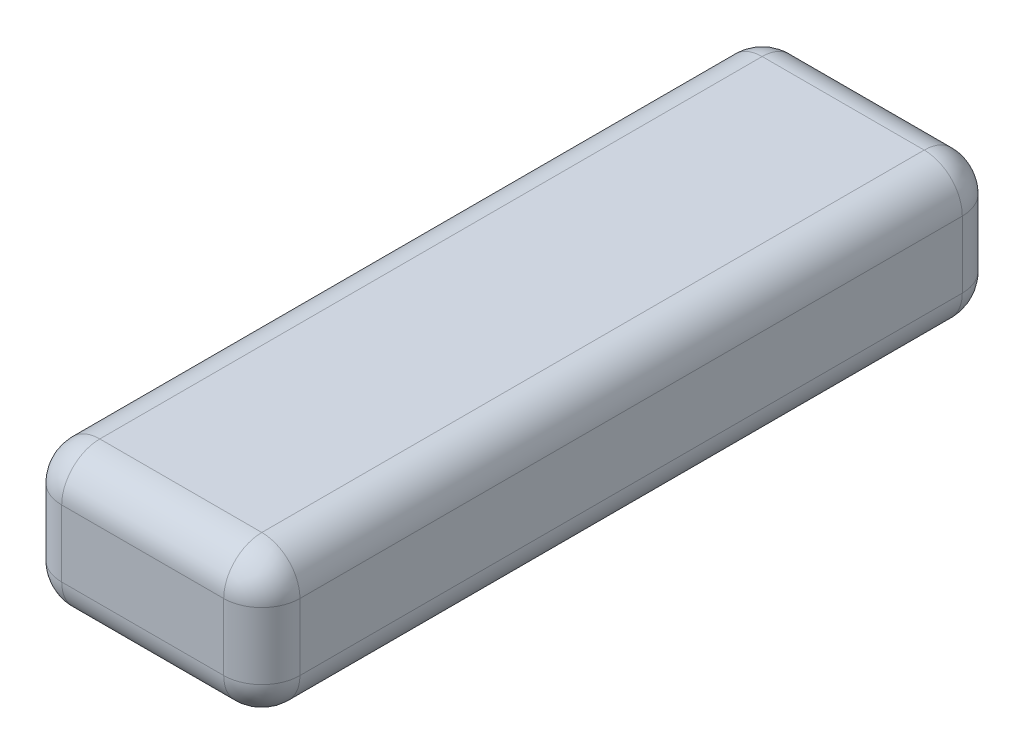
ISO-10303-21;
HEADER;
FILE_DESCRIPTION(('STEP AP214'),'2;1');
FILE_NAME('part.step','',(''),(''),'','','');
FILE_SCHEMA(('AUTOMOTIVE_DESIGN { 1 0 10303 214 1 1 1 1 }'));
ENDSEC;
DATA;
#1=APPLICATION_CONTEXT('core data for automotive mechanical design processes');
#2=APPLICATION_PROTOCOL_DEFINITION('international standard','automotive_design',2000,#1);
#3=PRODUCT_CONTEXT('',#1,'mechanical');
#4=PRODUCT('Part','Part','',(#3));
#5=PRODUCT_RELATED_PRODUCT_CATEGORY('part','',(#4));
#6=PRODUCT_DEFINITION_FORMATION('','',#4);
#7=PRODUCT_DEFINITION_CONTEXT('part definition',#1,'design');
#8=PRODUCT_DEFINITION('design','',#6,#7);
#9=PRODUCT_DEFINITION_SHAPE('','',#8);
#10=(LENGTH_UNIT() NAMED_UNIT(*) SI_UNIT(.MILLI.,.METRE.));
#11=(NAMED_UNIT(*) PLANE_ANGLE_UNIT() SI_UNIT($,.RADIAN.));
#12=(NAMED_UNIT(*) SI_UNIT($,.STERADIAN.) SOLID_ANGLE_UNIT());
#13=UNCERTAINTY_MEASURE_WITH_UNIT(LENGTH_MEASURE(1.E-05),#10,'distance_accuracy_value','');
#14=(GEOMETRIC_REPRESENTATION_CONTEXT(3) GLOBAL_UNCERTAINTY_ASSIGNED_CONTEXT((#13)) GLOBAL_UNIT_ASSIGNED_CONTEXT((#10,
#11,#12)) REPRESENTATION_CONTEXT('',''));
#15=CARTESIAN_POINT('',(0.,0.,0.));
#16=DIRECTION('',(0.,0.,1.));
#17=DIRECTION('',(1.,0.,0.));
#18=AXIS2_PLACEMENT_3D('',#15,#16,#17);
#19=CARTESIAN_POINT('',(-25.,15.,155.));
#20=DIRECTION('',(1.,0.,0.));
#21=DIRECTION('',(0.,1.,0.));
#22=AXIS2_PLACEMENT_3D('',#19,#20,#21);
#23=PLANE('',#22);
#24=DIRECTION('',(0.,-1.,0.));
#25=VECTOR('',#24,1.);
#26=CARTESIAN_POINT('',(-25.,15.,8.00000000000001));
#27=LINE('',#26,#25);
#28=CARTESIAN_POINT('',(-25.,6.99999999999999,8.00000000000001));
#29=VERTEX_POINT('',#28);
#30=CARTESIAN_POINT('',(-25.,-7.00000000000001,8.00000000000001));
#31=VERTEX_POINT('',#30);
#32=EDGE_CURVE('E163',#29,#31,#27,.T.);
#33=ORIENTED_EDGE('',*,*,#32,.T.);
#34=DIRECTION('',(0.,0.,-1.));
#35=VECTOR('',#34,1.);
#36=CARTESIAN_POINT('',(-25.,-7.00000000000001,155.));
#37=LINE('',#36,#35);
#38=CARTESIAN_POINT('',(-25.,-7.00000000000001,147.));
#39=VERTEX_POINT('',#38);
#40=EDGE_CURVE('E133',#31,#39,#37,.F.);
#41=ORIENTED_EDGE('',*,*,#40,.T.);
#42=DIRECTION('',(0.,-1.,0.));
#43=VECTOR('',#42,1.);
#44=CARTESIAN_POINT('',(-25.,15.,147.));
#45=LINE('',#44,#43);
#46=CARTESIAN_POINT('',(-25.,6.99999999999999,147.));
#47=VERTEX_POINT('',#46);
#48=EDGE_CURVE('E169',#39,#47,#45,.F.);
#49=ORIENTED_EDGE('',*,*,#48,.T.);
#50=DIRECTION('',(0.,0.,-1.));
#51=VECTOR('',#50,1.);
#52=CARTESIAN_POINT('',(-25.,6.99999999999999,155.));
#53=LINE('',#52,#51);
#54=EDGE_CURVE('E161',#47,#29,#53,.T.);
#55=ORIENTED_EDGE('',*,*,#54,.T.);
#56=EDGE_LOOP('',(#33,#41,#49,#55));
#57=FACE_BOUND('',#56,.T.);
#58=ADVANCED_FACE('F33',(#57),#23,.F.);
#59=CARTESIAN_POINT('',(-25.,-15.,155.));
#60=DIRECTION('',(0.,1.,0.));
#61=DIRECTION('',(-1.,0.,0.));
#62=AXIS2_PLACEMENT_3D('',#59,#60,#61);
#63=PLANE('',#62);
#64=DIRECTION('',(1.,0.,0.));
#65=VECTOR('',#64,1.);
#66=CARTESIAN_POINT('',(-25.,-15.,147.));
#67=LINE('',#66,#65);
#68=CARTESIAN_POINT('',(17.,-15.,147.));
#69=VERTEX_POINT('',#68);
#70=CARTESIAN_POINT('',(-17.,-15.,147.));
#71=VERTEX_POINT('',#70);
#72=EDGE_CURVE('E159',#69,#71,#67,.F.);
#73=ORIENTED_EDGE('',*,*,#72,.T.);
#74=DIRECTION('',(0.,0.,-1.));
#75=VECTOR('',#74,1.);
#76=CARTESIAN_POINT('',(-17.,-15.,155.));
#77=LINE('',#76,#75);
#78=CARTESIAN_POINT('',(-17.,-15.,8.00000000000001));
#79=VERTEX_POINT('',#78);
#80=EDGE_CURVE('E131',#71,#79,#77,.T.);
#81=ORIENTED_EDGE('',*,*,#80,.T.);
#82=DIRECTION('',(1.,0.,0.));
#83=VECTOR('',#82,1.);
#84=CARTESIAN_POINT('',(-25.,-15.,8.00000000000001));
#85=LINE('',#84,#83);
#86=CARTESIAN_POINT('',(17.,-15.,8.00000000000001));
#87=VERTEX_POINT('',#86);
#88=EDGE_CURVE('E149',#79,#87,#85,.T.);
#89=ORIENTED_EDGE('',*,*,#88,.T.);
#90=DIRECTION('',(0.,0.,-1.));
#91=VECTOR('',#90,1.);
#92=CARTESIAN_POINT('',(17.,-15.,155.));
#93=LINE('',#92,#91);
#94=EDGE_CURVE('E155',#87,#69,#93,.F.);
#95=ORIENTED_EDGE('',*,*,#94,.T.);
#96=EDGE_LOOP('',(#73,#81,#89,#95));
#97=FACE_BOUND('',#96,.T.);
#98=ADVANCED_FACE('F157',(#97),#63,.F.);
#99=CARTESIAN_POINT('',(25.,15.,155.));
#100=DIRECTION('',(-1.,0.,0.));
#101=DIRECTION('',(0.,-1.,0.));
#102=AXIS2_PLACEMENT_3D('',#99,#100,#101);
#103=PLANE('',#102);
#104=DIRECTION('',(0.,1.,0.));
#105=VECTOR('',#104,1.);
#106=CARTESIAN_POINT('',(25.,-15.,147.));
#107=LINE('',#106,#105);
#108=CARTESIAN_POINT('',(25.,6.99999999999999,147.));
#109=VERTEX_POINT('',#108);
#110=CARTESIAN_POINT('',(25.,-7.00000000000001,147.));
#111=VERTEX_POINT('',#110);
#112=EDGE_CURVE('E183',#109,#111,#107,.F.);
#113=ORIENTED_EDGE('',*,*,#112,.T.);
#114=DIRECTION('',(0.,0.,-1.));
#115=VECTOR('',#114,1.);
#116=CARTESIAN_POINT('',(25.,-7.,155.));
#117=LINE('',#116,#115);
#118=CARTESIAN_POINT('',(25.,-7.00000000000001,8.00000000000001));
#119=VERTEX_POINT('',#118);
#120=EDGE_CURVE('E187',#111,#119,#117,.T.);
#121=ORIENTED_EDGE('',*,*,#120,.T.);
#122=DIRECTION('',(0.,1.,0.));
#123=VECTOR('',#122,1.);
#124=CARTESIAN_POINT('',(25.,15.,8.00000000000001));
#125=LINE('',#124,#123);
#126=CARTESIAN_POINT('',(25.,6.99999999999999,8.00000000000001));
#127=VERTEX_POINT('',#126);
#128=EDGE_CURVE('E185',#119,#127,#125,.T.);
#129=ORIENTED_EDGE('',*,*,#128,.T.);
#130=DIRECTION('',(0.,0.,-1.));
#131=VECTOR('',#130,1.);
#132=CARTESIAN_POINT('',(25.,6.99999999999999,155.));
#133=LINE('',#132,#131);
#134=EDGE_CURVE('E181',#127,#109,#133,.F.);
#135=ORIENTED_EDGE('',*,*,#134,.T.);
#136=EDGE_LOOP('',(#113,#121,#129,#135));
#137=FACE_BOUND('',#136,.T.);
#138=ADVANCED_FACE('F281',(#137),#103,.F.);
#139=CARTESIAN_POINT('',(-25.,15.,155.));
#140=DIRECTION('',(0.,-1.,0.));
#141=DIRECTION('',(0.,0.,-1.));
#142=AXIS2_PLACEMENT_3D('',#139,#140,#141);
#143=PLANE('',#142);
#144=DIRECTION('',(0.,0.,-1.));
#145=VECTOR('',#144,1.);
#146=CARTESIAN_POINT('',(17.,15.,155.));
#147=LINE('',#146,#145);
#148=CARTESIAN_POINT('',(17.,15.,147.));
#149=VERTEX_POINT('',#148);
#150=CARTESIAN_POINT('',(17.,15.,8.00000000000001));
#151=VERTEX_POINT('',#150);
#152=EDGE_CURVE('E57',#149,#151,#147,.T.);
#153=ORIENTED_EDGE('',*,*,#152,.T.);
#154=DIRECTION('',(-1.,0.,0.));
#155=VECTOR('',#154,1.);
#156=CARTESIAN_POINT('',(-25.,15.,8.00000000000001));
#157=LINE('',#156,#155);
#158=CARTESIAN_POINT('',(-17.,15.,8.00000000000001));
#159=VERTEX_POINT('',#158);
#160=EDGE_CURVE('E11',#151,#159,#157,.T.);
#161=ORIENTED_EDGE('',*,*,#160,.T.);
#162=DIRECTION('',(0.,0.,-1.));
#163=VECTOR('',#162,1.);
#164=CARTESIAN_POINT('',(-17.,15.,155.));
#165=LINE('',#164,#163);
#166=CARTESIAN_POINT('',(-17.,15.,147.));
#167=VERTEX_POINT('',#166);
#168=EDGE_CURVE('E42',#159,#167,#165,.F.);
#169=ORIENTED_EDGE('',*,*,#168,.T.);
#170=DIRECTION('',(-1.,0.,0.));
#171=VECTOR('',#170,1.);
#172=CARTESIAN_POINT('',(25.,15.,147.));
#173=LINE('',#172,#171);
#174=EDGE_CURVE('E199',#167,#149,#173,.F.);
#175=ORIENTED_EDGE('',*,*,#174,.T.);
#176=EDGE_LOOP('',(#153,#161,#169,#175));
#177=FACE_BOUND('',#176,.T.);
#178=ADVANCED_FACE('F299',(#177),#143,.F.);
#179=CARTESIAN_POINT('',(0.,0.,155.));
#180=DIRECTION('',(0.,0.,1.));
#181=DIRECTION('',(1.,0.,0.));
#182=AXIS2_PLACEMENT_3D('',#179,#180,#181);
#183=PLANE('',#182);
#184=DIRECTION('',(0.,-1.,0.));
#185=VECTOR('',#184,1.);
#186=CARTESIAN_POINT('',(-17.,-15.,155.));
#187=LINE('',#186,#185);
#188=CARTESIAN_POINT('',(-17.,6.99999999999999,155.));
#189=VERTEX_POINT('',#188);
#190=CARTESIAN_POINT('',(-17.,-7.00000000000001,155.));
#191=VERTEX_POINT('',#190);
#192=EDGE_CURVE('E176',#189,#191,#187,.T.);
#193=ORIENTED_EDGE('',*,*,#192,.T.);
#194=DIRECTION('',(1.,0.,0.));
#195=VECTOR('',#194,1.);
#196=CARTESIAN_POINT('',(25.,-7.,155.));
#197=LINE('',#196,#195);
#198=CARTESIAN_POINT('',(17.,-7.,155.));
#199=VERTEX_POINT('',#198);
#200=EDGE_CURVE('E178',#191,#199,#197,.T.);
#201=ORIENTED_EDGE('',*,*,#200,.T.);
#202=DIRECTION('',(0.,1.,0.));
#203=VECTOR('',#202,1.);
#204=CARTESIAN_POINT('',(17.,15.,155.));
#205=LINE('',#204,#203);
#206=CARTESIAN_POINT('',(17.,6.99999999999999,155.));
#207=VERTEX_POINT('',#206);
#208=EDGE_CURVE('E174',#199,#207,#205,.T.);
#209=ORIENTED_EDGE('',*,*,#208,.T.);
#210=DIRECTION('',(-1.,0.,0.));
#211=VECTOR('',#210,1.);
#212=CARTESIAN_POINT('',(-25.,6.99999999999999,155.));
#213=LINE('',#212,#211);
#214=EDGE_CURVE('E172',#207,#189,#213,.T.);
#215=ORIENTED_EDGE('',*,*,#214,.T.);
#216=EDGE_LOOP('',(#193,#201,#209,#215));
#217=FACE_BOUND('',#216,.T.);
#218=ADVANCED_FACE('F272',(#217),#183,.T.);
#219=CARTESIAN_POINT('',(0.,0.,0.));
#220=DIRECTION('',(0.,0.,1.));
#221=DIRECTION('',(1.,0.,0.));
#222=AXIS2_PLACEMENT_3D('',#219,#220,#221);
#223=PLANE('',#222);
#224=DIRECTION('',(0.,1.,0.));
#225=VECTOR('',#224,1.);
#226=CARTESIAN_POINT('',(17.,0.,0.));
#227=LINE('',#226,#225);
#228=CARTESIAN_POINT('',(17.,6.99999999999999,0.));
#229=VERTEX_POINT('',#228);
#230=CARTESIAN_POINT('',(17.,-7.,0.));
#231=VERTEX_POINT('',#230);
#232=EDGE_CURVE('E192',#229,#231,#227,.F.);
#233=ORIENTED_EDGE('',*,*,#232,.T.);
#234=DIRECTION('',(1.,0.,0.));
#235=VECTOR('',#234,1.);
#236=CARTESIAN_POINT('',(0.,-7.00000000000001,0.));
#237=LINE('',#236,#235);
#238=CARTESIAN_POINT('',(-17.,-7.00000000000001,0.));
#239=VERTEX_POINT('',#238);
#240=EDGE_CURVE('E196',#231,#239,#237,.F.);
#241=ORIENTED_EDGE('',*,*,#240,.T.);
#242=DIRECTION('',(0.,-1.,0.));
#243=VECTOR('',#242,1.);
#244=CARTESIAN_POINT('',(-17.,0.,0.));
#245=LINE('',#244,#243);
#246=CARTESIAN_POINT('',(-17.,6.99999999999999,0.));
#247=VERTEX_POINT('',#246);
#248=EDGE_CURVE('E194',#239,#247,#245,.F.);
#249=ORIENTED_EDGE('',*,*,#248,.T.);
#250=DIRECTION('',(-1.,0.,0.));
#251=VECTOR('',#250,1.);
#252=CARTESIAN_POINT('',(0.,6.99999999999999,0.));
#253=LINE('',#252,#251);
#254=EDGE_CURVE('E190',#247,#229,#253,.F.);
#255=ORIENTED_EDGE('',*,*,#254,.T.);
#256=EDGE_LOOP('',(#233,#241,#249,#255));
#257=FACE_BOUND('',#256,.T.);
#258=ADVANCED_FACE('F476',(#257),#223,.F.);
#259=CARTESIAN_POINT('',(17.,6.99999999999999,155.));
#260=DIRECTION('',(0.,0.,-1.));
#261=DIRECTION('',(-1.,0.,0.));
#262=AXIS2_PLACEMENT_3D('',#259,#260,#261);
#263=CYLINDRICAL_SURFACE('',#262,8.);
#264=CARTESIAN_POINT('',(17.,6.99999999999999,147.));
#265=DIRECTION('',(0.,0.,1.));
#266=DIRECTION('',(1.,0.,0.));
#267=AXIS2_PLACEMENT_3D('',#264,#265,#266);
#268=CIRCLE('',#267,8.);
#269=EDGE_CURVE('E37',#109,#149,#268,.T.);
#270=ORIENTED_EDGE('',*,*,#269,.F.);
#271=ORIENTED_EDGE('',*,*,#134,.F.);
#272=CARTESIAN_POINT('',(17.,6.99999999999999,8.00000000000001));
#273=DIRECTION('',(0.,0.,-1.));
#274=DIRECTION('',(-1.,0.,0.));
#275=AXIS2_PLACEMENT_3D('',#272,#273,#274);
#276=CIRCLE('',#275,8.);
#277=EDGE_CURVE('E250',#151,#127,#276,.T.);
#278=ORIENTED_EDGE('',*,*,#277,.F.);
#279=ORIENTED_EDGE('',*,*,#152,.F.);
#280=EDGE_LOOP('',(#270,#271,#278,#279));
#281=FACE_BOUND('',#280,.T.);
#282=ADVANCED_FACE('F35',(#281),#263,.T.);
#283=CARTESIAN_POINT('',(17.,6.99999999999999,147.));
#284=DIRECTION('',(0.,0.,1.));
#285=DIRECTION('',(1.,0.,0.));
#286=AXIS2_PLACEMENT_3D('',#283,#284,#285);
#287=SPHERICAL_SURFACE('',#286,8.);
#288=CARTESIAN_POINT('',(17.,6.99999999999999,147.));
#289=DIRECTION('',(0.,1.,0.));
#290=DIRECTION('',(-1.,0.,0.));
#291=AXIS2_PLACEMENT_3D('',#288,#289,#290);
#292=CIRCLE('',#291,8.);
#293=EDGE_CURVE('E245',#109,#207,#292,.F.);
#294=ORIENTED_EDGE('',*,*,#293,.F.);
#295=ORIENTED_EDGE('',*,*,#269,.T.);
#296=CARTESIAN_POINT('',(17.,6.99999999999999,147.));
#297=DIRECTION('',(1.,0.,0.));
#298=DIRECTION('',(0.,0.,-1.));
#299=AXIS2_PLACEMENT_3D('',#296,#297,#298);
#300=CIRCLE('',#299,8.);
#301=EDGE_CURVE('E248',#207,#149,#300,.F.);
#302=ORIENTED_EDGE('',*,*,#301,.F.);
#303=EDGE_LOOP('',(#294,#295,#302));
#304=FACE_BOUND('',#303,.T.);
#305=ADVANCED_FACE('F260',(#304),#287,.T.);
#306=CARTESIAN_POINT('',(17.,6.99999999999999,8.));
#307=DIRECTION('',(0.,0.,1.));
#308=DIRECTION('',(1.,0.,0.));
#309=AXIS2_PLACEMENT_3D('',#306,#307,#308);
#310=SPHERICAL_SURFACE('',#309,8.);
#311=CARTESIAN_POINT('',(17.,6.99999999999999,8.));
#312=DIRECTION('',(1.,0.,0.));
#313=DIRECTION('',(0.,0.,-1.));
#314=AXIS2_PLACEMENT_3D('',#311,#312,#313);
#315=CIRCLE('',#314,8.);
#316=EDGE_CURVE('E239',#151,#229,#315,.F.);
#317=ORIENTED_EDGE('',*,*,#316,.F.);
#318=ORIENTED_EDGE('',*,*,#277,.T.);
#319=CARTESIAN_POINT('',(17.,6.99999999999999,8.00000000000001));
#320=DIRECTION('',(0.,1.,0.));
#321=DIRECTION('',(-1.,0.,0.));
#322=AXIS2_PLACEMENT_3D('',#319,#320,#321);
#323=CIRCLE('',#322,8.);
#324=EDGE_CURVE('E242',#229,#127,#323,.F.);
#325=ORIENTED_EDGE('',*,*,#324,.F.);
#326=EDGE_LOOP('',(#317,#318,#325));
#327=FACE_BOUND('',#326,.T.);
#328=ADVANCED_FACE('F294',(#327),#310,.T.);
#329=CARTESIAN_POINT('',(0.,6.99999999999999,147.));
#330=DIRECTION('',(1.,0.,0.));
#331=DIRECTION('',(0.,0.,-1.));
#332=AXIS2_PLACEMENT_3D('',#329,#330,#331);
#333=CYLINDRICAL_SURFACE('',#332,8.);
#334=ORIENTED_EDGE('',*,*,#301,.T.);
#335=ORIENTED_EDGE('',*,*,#174,.F.);
#336=CARTESIAN_POINT('',(-17.,6.99999999999999,147.));
#337=DIRECTION('',(-1.,0.,0.));
#338=DIRECTION('',(0.,0.,1.));
#339=AXIS2_PLACEMENT_3D('',#336,#337,#338);
#340=CIRCLE('',#339,8.);
#341=EDGE_CURVE('E233',#189,#167,#340,.T.);
#342=ORIENTED_EDGE('',*,*,#341,.F.);
#343=ORIENTED_EDGE('',*,*,#214,.F.);
#344=EDGE_LOOP('',(#334,#335,#342,#343));
#345=FACE_BOUND('',#344,.T.);
#346=ADVANCED_FACE('F267',(#345),#333,.T.);
#347=CARTESIAN_POINT('',(17.,0.,147.));
#348=DIRECTION('',(0.,-1.,0.));
#349=DIRECTION('',(1.,0.,0.));
#350=AXIS2_PLACEMENT_3D('',#347,#348,#349);
#351=CYLINDRICAL_SURFACE('',#350,8.);
#352=ORIENTED_EDGE('',*,*,#293,.T.);
#353=ORIENTED_EDGE('',*,*,#208,.F.);
#354=CARTESIAN_POINT('',(17.,-7.00000000000001,147.));
#355=DIRECTION('',(0.,-1.,0.));
#356=DIRECTION('',(0.,0.,-1.));
#357=AXIS2_PLACEMENT_3D('',#354,#355,#356);
#358=CIRCLE('',#357,8.);
#359=EDGE_CURVE('E230',#111,#199,#358,.T.);
#360=ORIENTED_EDGE('',*,*,#359,.F.);
#361=ORIENTED_EDGE('',*,*,#112,.F.);
#362=EDGE_LOOP('',(#352,#353,#360,#361));
#363=FACE_BOUND('',#362,.T.);
#364=ADVANCED_FACE('F278',(#363),#351,.T.);
#365=CARTESIAN_POINT('',(17.,-7.00000000000001,155.));
#366=DIRECTION('',(0.,0.,-1.));
#367=DIRECTION('',(-1.,0.,0.));
#368=AXIS2_PLACEMENT_3D('',#365,#366,#367);
#369=CYLINDRICAL_SURFACE('',#368,8.);
#370=CARTESIAN_POINT('',(17.,-7.00000000000001,8.00000000000001));
#371=DIRECTION('',(0.,0.,-1.));
#372=DIRECTION('',(-1.,0.,0.));
#373=AXIS2_PLACEMENT_3D('',#370,#371,#372);
#374=CIRCLE('',#373,8.);
#375=EDGE_CURVE('E224',#119,#87,#374,.T.);
#376=ORIENTED_EDGE('',*,*,#375,.F.);
#377=ORIENTED_EDGE('',*,*,#120,.F.);
#378=CARTESIAN_POINT('',(17.,-7.,147.));
#379=DIRECTION('',(0.,0.,1.));
#380=DIRECTION('',(1.,0.,0.));
#381=AXIS2_PLACEMENT_3D('',#378,#379,#380);
#382=CIRCLE('',#381,8.);
#383=EDGE_CURVE('E227',#69,#111,#382,.T.);
#384=ORIENTED_EDGE('',*,*,#383,.F.);
#385=ORIENTED_EDGE('',*,*,#94,.F.);
#386=EDGE_LOOP('',(#376,#377,#384,#385));
#387=FACE_BOUND('',#386,.T.);
#388=ADVANCED_FACE('F285',(#387),#369,.T.);
#389=CARTESIAN_POINT('',(17.,15.,8.00000000000001));
#390=DIRECTION('',(0.,1.,0.));
#391=DIRECTION('',(-1.,0.,0.));
#392=AXIS2_PLACEMENT_3D('',#389,#390,#391);
#393=CYLINDRICAL_SURFACE('',#392,8.);
#394=ORIENTED_EDGE('',*,*,#324,.T.);
#395=ORIENTED_EDGE('',*,*,#128,.F.);
#396=CARTESIAN_POINT('',(17.,-7.,8.));
#397=DIRECTION('',(0.,-1.,0.));
#398=DIRECTION('',(1.,0.,0.));
#399=AXIS2_PLACEMENT_3D('',#396,#397,#398);
#400=CIRCLE('',#399,8.);
#401=EDGE_CURVE('E222',#231,#119,#400,.T.);
#402=ORIENTED_EDGE('',*,*,#401,.F.);
#403=ORIENTED_EDGE('',*,*,#232,.F.);
#404=EDGE_LOOP('',(#394,#395,#402,#403));
#405=FACE_BOUND('',#404,.T.);
#406=ADVANCED_FACE('F291',(#405),#393,.T.);
#407=CARTESIAN_POINT('',(-25.,6.99999999999999,8.00000000000001));
#408=DIRECTION('',(-1.,0.,0.));
#409=DIRECTION('',(0.,0.,1.));
#410=AXIS2_PLACEMENT_3D('',#407,#408,#409);
#411=CYLINDRICAL_SURFACE('',#410,8.);
#412=ORIENTED_EDGE('',*,*,#316,.T.);
#413=ORIENTED_EDGE('',*,*,#254,.F.);
#414=CARTESIAN_POINT('',(-17.,6.99999999999999,8.00000000000001));
#415=DIRECTION('',(-1.,0.,0.));
#416=DIRECTION('',(0.,0.,1.));
#417=AXIS2_PLACEMENT_3D('',#414,#415,#416);
#418=CIRCLE('',#417,8.);
#419=EDGE_CURVE('E220',#159,#247,#418,.T.);
#420=ORIENTED_EDGE('',*,*,#419,.F.);
#421=ORIENTED_EDGE('',*,*,#160,.F.);
#422=EDGE_LOOP('',(#412,#413,#420,#421));
#423=FACE_BOUND('',#422,.T.);
#424=ADVANCED_FACE('F297',(#423),#411,.T.);
#425=CARTESIAN_POINT('',(-17.,6.99999999999999,155.));
#426=DIRECTION('',(0.,0.,-1.));
#427=DIRECTION('',(-1.,0.,0.));
#428=AXIS2_PLACEMENT_3D('',#425,#426,#427);
#429=CYLINDRICAL_SURFACE('',#428,8.);
#430=CARTESIAN_POINT('',(-17.,6.99999999999999,147.));
#431=DIRECTION('',(0.,0.,1.));
#432=DIRECTION('',(1.,0.,0.));
#433=AXIS2_PLACEMENT_3D('',#430,#431,#432);
#434=CIRCLE('',#433,8.);
#435=EDGE_CURVE('E236',#167,#47,#434,.T.);
#436=ORIENTED_EDGE('',*,*,#435,.F.);
#437=ORIENTED_EDGE('',*,*,#168,.F.);
#438=CARTESIAN_POINT('',(-17.,6.99999999999999,8.00000000000001));
#439=DIRECTION('',(0.,0.,-1.));
#440=DIRECTION('',(-1.,0.,0.));
#441=AXIS2_PLACEMENT_3D('',#438,#439,#440);
#442=CIRCLE('',#441,8.);
#443=EDGE_CURVE('E50',#29,#159,#442,.T.);
#444=ORIENTED_EDGE('',*,*,#443,.F.);
#445=ORIENTED_EDGE('',*,*,#54,.F.);
#446=EDGE_LOOP('',(#436,#437,#444,#445));
#447=FACE_BOUND('',#446,.T.);
#448=ADVANCED_FACE('F301',(#447),#429,.T.);
#449=CARTESIAN_POINT('',(-17.,6.99999999999999,147.));
#450=DIRECTION('',(0.,0.,1.));
#451=DIRECTION('',(1.,0.,0.));
#452=AXIS2_PLACEMENT_3D('',#449,#450,#451);
#453=SPHERICAL_SURFACE('',#452,8.);
#454=ORIENTED_EDGE('',*,*,#341,.T.);
#455=ORIENTED_EDGE('',*,*,#435,.T.);
#456=CARTESIAN_POINT('',(-17.,6.99999999999999,147.));
#457=DIRECTION('',(0.,1.,0.));
#458=DIRECTION('',(-1.,0.,0.));
#459=AXIS2_PLACEMENT_3D('',#456,#457,#458);
#460=CIRCLE('',#459,8.);
#461=EDGE_CURVE('E216',#189,#47,#460,.F.);
#462=ORIENTED_EDGE('',*,*,#461,.F.);
#463=EDGE_LOOP('',(#454,#455,#462));
#464=FACE_BOUND('',#463,.T.);
#465=ADVANCED_FACE('F304',(#464),#453,.T.);
#466=CARTESIAN_POINT('',(17.,-7.,147.));
#467=DIRECTION('',(0.,0.,1.));
#468=DIRECTION('',(1.,0.,0.));
#469=AXIS2_PLACEMENT_3D('',#466,#467,#468);
#470=SPHERICAL_SURFACE('',#469,8.);
#471=ORIENTED_EDGE('',*,*,#383,.T.);
#472=ORIENTED_EDGE('',*,*,#359,.T.);
#473=CARTESIAN_POINT('',(17.,-7.,147.));
#474=DIRECTION('',(1.,0.,0.));
#475=DIRECTION('',(0.,0.,-1.));
#476=AXIS2_PLACEMENT_3D('',#473,#474,#475);
#477=CIRCLE('',#476,8.);
#478=EDGE_CURVE('E214',#69,#199,#477,.F.);
#479=ORIENTED_EDGE('',*,*,#478,.F.);
#480=EDGE_LOOP('',(#471,#472,#479));
#481=FACE_BOUND('',#480,.T.);
#482=ADVANCED_FACE('F315',(#481),#470,.T.);
#483=CARTESIAN_POINT('',(17.,-7.,8.));
#484=DIRECTION('',(0.,0.,1.));
#485=DIRECTION('',(1.,0.,0.));
#486=AXIS2_PLACEMENT_3D('',#483,#484,#485);
#487=SPHERICAL_SURFACE('',#486,8.);
#488=ORIENTED_EDGE('',*,*,#401,.T.);
#489=ORIENTED_EDGE('',*,*,#375,.T.);
#490=CARTESIAN_POINT('',(17.,-7.,8.00000000000001));
#491=DIRECTION('',(1.,0.,0.));
#492=DIRECTION('',(0.,0.,-1.));
#493=AXIS2_PLACEMENT_3D('',#490,#491,#492);
#494=CIRCLE('',#493,8.);
#495=EDGE_CURVE('E152',#231,#87,#494,.F.);
#496=ORIENTED_EDGE('',*,*,#495,.F.);
#497=EDGE_LOOP('',(#488,#489,#496));
#498=FACE_BOUND('',#497,.T.);
#499=ADVANCED_FACE('F317',(#498),#487,.T.);
#500=CARTESIAN_POINT('',(-17.,6.99999999999999,8.));
#501=DIRECTION('',(0.,0.,1.));
#502=DIRECTION('',(1.,0.,0.));
#503=AXIS2_PLACEMENT_3D('',#500,#501,#502);
#504=SPHERICAL_SURFACE('',#503,8.);
#505=ORIENTED_EDGE('',*,*,#443,.T.);
#506=ORIENTED_EDGE('',*,*,#419,.T.);
#507=CARTESIAN_POINT('',(-17.,6.99999999999999,8.));
#508=DIRECTION('',(0.,1.,0.));
#509=DIRECTION('',(-1.,0.,0.));
#510=AXIS2_PLACEMENT_3D('',#507,#508,#509);
#511=CIRCLE('',#510,8.);
#512=EDGE_CURVE('E210',#29,#247,#511,.F.);
#513=ORIENTED_EDGE('',*,*,#512,.F.);
#514=EDGE_LOOP('',(#505,#506,#513));
#515=FACE_BOUND('',#514,.T.);
#516=ADVANCED_FACE('F323',(#515),#504,.T.);
#517=CARTESIAN_POINT('',(-17.,0.,147.));
#518=DIRECTION('',(0.,1.,0.));
#519=DIRECTION('',(-1.,0.,0.));
#520=AXIS2_PLACEMENT_3D('',#517,#518,#519);
#521=CYLINDRICAL_SURFACE('',#520,8.);
#522=ORIENTED_EDGE('',*,*,#461,.T.);
#523=ORIENTED_EDGE('',*,*,#48,.F.);
#524=CARTESIAN_POINT('',(-17.,-7.00000000000001,147.));
#525=DIRECTION('',(0.,-1.,0.));
#526=DIRECTION('',(1.,0.,0.));
#527=AXIS2_PLACEMENT_3D('',#524,#525,#526);
#528=CIRCLE('',#527,8.);
#529=EDGE_CURVE('E207',#191,#39,#528,.T.);
#530=ORIENTED_EDGE('',*,*,#529,.F.);
#531=ORIENTED_EDGE('',*,*,#192,.F.);
#532=EDGE_LOOP('',(#522,#523,#530,#531));
#533=FACE_BOUND('',#532,.T.);
#534=ADVANCED_FACE('F308',(#533),#521,.T.);
#535=CARTESIAN_POINT('',(0.,-7.00000000000001,147.));
#536=DIRECTION('',(-1.,0.,0.));
#537=DIRECTION('',(0.,-1.,0.));
#538=AXIS2_PLACEMENT_3D('',#535,#536,#537);
#539=CYLINDRICAL_SURFACE('',#538,8.);
#540=ORIENTED_EDGE('',*,*,#478,.T.);
#541=ORIENTED_EDGE('',*,*,#200,.F.);
#542=CARTESIAN_POINT('',(-17.,-7.00000000000001,147.));
#543=DIRECTION('',(-1.,0.,0.));
#544=DIRECTION('',(0.,0.,1.));
#545=AXIS2_PLACEMENT_3D('',#542,#543,#544);
#546=CIRCLE('',#545,8.);
#547=EDGE_CURVE('E146',#71,#191,#546,.T.);
#548=ORIENTED_EDGE('',*,*,#547,.F.);
#549=ORIENTED_EDGE('',*,*,#72,.F.);
#550=EDGE_LOOP('',(#540,#541,#548,#549));
#551=FACE_BOUND('',#550,.T.);
#552=ADVANCED_FACE('F313',(#551),#539,.T.);
#553=CARTESIAN_POINT('',(-25.,-7.00000000000001,8.00000000000001));
#554=DIRECTION('',(1.,0.,0.));
#555=DIRECTION('',(0.,1.,0.));
#556=AXIS2_PLACEMENT_3D('',#553,#554,#555);
#557=CYLINDRICAL_SURFACE('',#556,8.);
#558=ORIENTED_EDGE('',*,*,#495,.T.);
#559=ORIENTED_EDGE('',*,*,#88,.F.);
#560=CARTESIAN_POINT('',(-17.,-7.00000000000001,8.));
#561=DIRECTION('',(-1.,0.,0.));
#562=DIRECTION('',(0.,0.,1.));
#563=AXIS2_PLACEMENT_3D('',#560,#561,#562);
#564=CIRCLE('',#563,8.);
#565=EDGE_CURVE('E138',#239,#79,#564,.T.);
#566=ORIENTED_EDGE('',*,*,#565,.F.);
#567=ORIENTED_EDGE('',*,*,#240,.F.);
#568=EDGE_LOOP('',(#558,#559,#566,#567));
#569=FACE_BOUND('',#568,.T.);
#570=ADVANCED_FACE('F150',(#569),#557,.T.);
#571=CARTESIAN_POINT('',(-17.,15.,8.00000000000001));
#572=DIRECTION('',(0.,-1.,0.));
#573=DIRECTION('',(1.,0.,0.));
#574=AXIS2_PLACEMENT_3D('',#571,#572,#573);
#575=CYLINDRICAL_SURFACE('',#574,8.);
#576=ORIENTED_EDGE('',*,*,#512,.T.);
#577=ORIENTED_EDGE('',*,*,#248,.F.);
#578=CARTESIAN_POINT('',(-17.,-7.00000000000001,8.00000000000001));
#579=DIRECTION('',(0.,-1.,0.));
#580=DIRECTION('',(1.,0.,0.));
#581=AXIS2_PLACEMENT_3D('',#578,#579,#580);
#582=CIRCLE('',#581,8.);
#583=EDGE_CURVE('E142',#31,#239,#582,.T.);
#584=ORIENTED_EDGE('',*,*,#583,.F.);
#585=ORIENTED_EDGE('',*,*,#32,.F.);
#586=EDGE_LOOP('',(#576,#577,#584,#585));
#587=FACE_BOUND('',#586,.T.);
#588=ADVANCED_FACE('F341',(#587),#575,.T.);
#589=CARTESIAN_POINT('',(-17.,-7.00000000000001,147.));
#590=DIRECTION('',(0.,0.,1.));
#591=DIRECTION('',(1.,0.,0.));
#592=AXIS2_PLACEMENT_3D('',#589,#590,#591);
#593=SPHERICAL_SURFACE('',#592,8.);
#594=ORIENTED_EDGE('',*,*,#547,.T.);
#595=ORIENTED_EDGE('',*,*,#529,.T.);
#596=CARTESIAN_POINT('',(-17.,-7.00000000000001,147.));
#597=DIRECTION('',(0.,0.,1.));
#598=DIRECTION('',(1.,0.,0.));
#599=AXIS2_PLACEMENT_3D('',#596,#597,#598);
#600=CIRCLE('',#599,8.);
#601=EDGE_CURVE('E135',#71,#39,#600,.F.);
#602=ORIENTED_EDGE('',*,*,#601,.F.);
#603=EDGE_LOOP('',(#594,#595,#602));
#604=FACE_BOUND('',#603,.T.);
#605=ADVANCED_FACE('F311',(#604),#593,.T.);
#606=CARTESIAN_POINT('',(-17.,-7.00000000000001,8.));
#607=DIRECTION('',(0.,0.,1.));
#608=DIRECTION('',(1.,0.,0.));
#609=AXIS2_PLACEMENT_3D('',#606,#607,#608);
#610=SPHERICAL_SURFACE('',#609,8.);
#611=ORIENTED_EDGE('',*,*,#583,.T.);
#612=ORIENTED_EDGE('',*,*,#565,.T.);
#613=CARTESIAN_POINT('',(-17.,-7.00000000000001,8.00000000000001));
#614=DIRECTION('',(0.,0.,-1.));
#615=DIRECTION('',(-1.,0.,0.));
#616=AXIS2_PLACEMENT_3D('',#613,#614,#615);
#617=CIRCLE('',#616,8.);
#618=EDGE_CURVE('E127',#31,#79,#617,.F.);
#619=ORIENTED_EDGE('',*,*,#618,.F.);
#620=EDGE_LOOP('',(#611,#612,#619));
#621=FACE_BOUND('',#620,.T.);
#622=ADVANCED_FACE('F140',(#621),#610,.T.);
#623=CARTESIAN_POINT('',(-17.,-7.00000000000001,155.));
#624=DIRECTION('',(0.,0.,-1.));
#625=DIRECTION('',(-1.,0.,0.));
#626=AXIS2_PLACEMENT_3D('',#623,#624,#625);
#627=CYLINDRICAL_SURFACE('',#626,8.);
#628=ORIENTED_EDGE('',*,*,#601,.T.);
#629=ORIENTED_EDGE('',*,*,#40,.F.);
#630=ORIENTED_EDGE('',*,*,#618,.T.);
#631=ORIENTED_EDGE('',*,*,#80,.F.);
#632=EDGE_LOOP('',(#628,#629,#630,#631));
#633=FACE_BOUND('',#632,.T.);
#634=ADVANCED_FACE('F129',(#633),#627,.T.);
#635=CLOSED_SHELL('',(#58,#98,#138,#178,#218,#258,#282,#305,#328,#346,#364,#388,#406,#424,#448,
#465,#482,#499,#516,#534,#552,#570,#588,#605,#622,#634));
#636=MANIFOLD_SOLID_BREP('B2',#635);
#637=ADVANCED_BREP_SHAPE_REPRESENTATION('',(#18,#636),#14);
#638=SHAPE_DEFINITION_REPRESENTATION(#9,#637);
ENDSEC;
END-ISO-10303-21;
